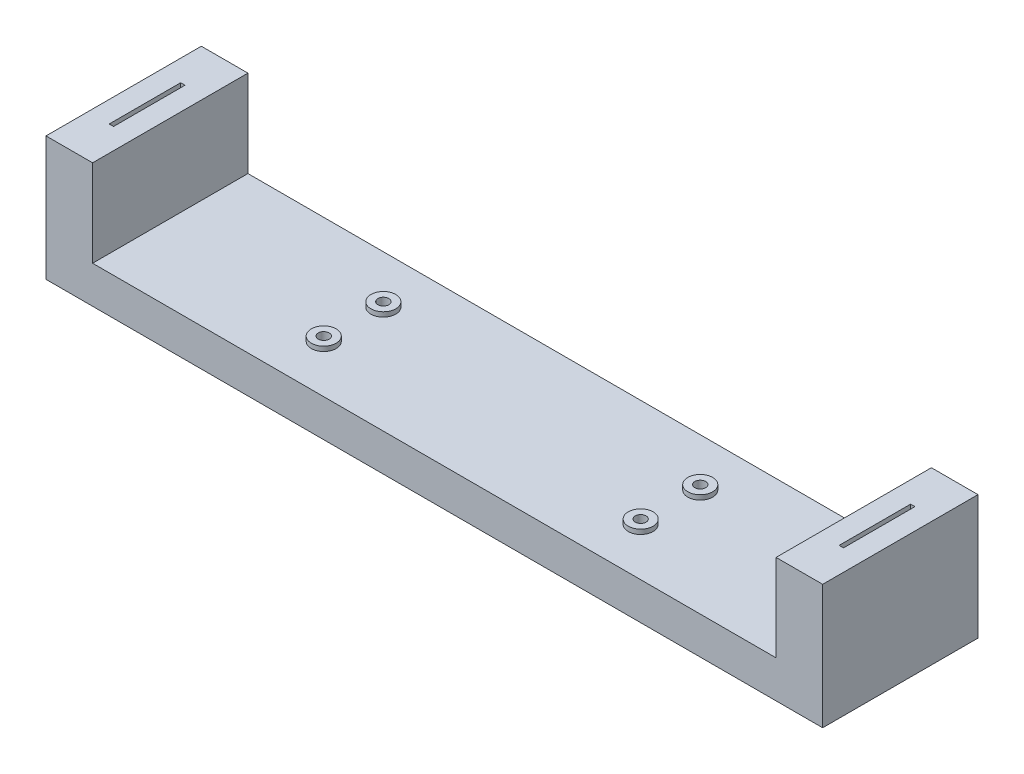
ISO-10303-21;
HEADER;
FILE_DESCRIPTION(('STEP AP214'),'2;1');
FILE_NAME('part.step','',(''),(''),'','','');
FILE_SCHEMA(('AUTOMOTIVE_DESIGN { 1 0 10303 214 1 1 1 1 }'));
ENDSEC;
DATA;
#1=APPLICATION_CONTEXT('core data for automotive mechanical design processes');
#2=APPLICATION_PROTOCOL_DEFINITION('international standard','automotive_design',2000,#1);
#3=PRODUCT_CONTEXT('',#1,'mechanical');
#4=PRODUCT('Part','Part','',(#3));
#5=PRODUCT_RELATED_PRODUCT_CATEGORY('part','',(#4));
#6=PRODUCT_DEFINITION_FORMATION('','',#4);
#7=PRODUCT_DEFINITION_CONTEXT('part definition',#1,'design');
#8=PRODUCT_DEFINITION('design','',#6,#7);
#9=PRODUCT_DEFINITION_SHAPE('','',#8);
#10=(LENGTH_UNIT() NAMED_UNIT(*) SI_UNIT(.MILLI.,.METRE.));
#11=(NAMED_UNIT(*) PLANE_ANGLE_UNIT() SI_UNIT($,.RADIAN.));
#12=(NAMED_UNIT(*) SI_UNIT($,.STERADIAN.) SOLID_ANGLE_UNIT());
#13=UNCERTAINTY_MEASURE_WITH_UNIT(LENGTH_MEASURE(1.E-05),#10,'distance_accuracy_value','');
#14=(GEOMETRIC_REPRESENTATION_CONTEXT(3) GLOBAL_UNCERTAINTY_ASSIGNED_CONTEXT((#13)) GLOBAL_UNIT_ASSIGNED_CONTEXT((#10,
#11,#12)) REPRESENTATION_CONTEXT('',''));
#15=CARTESIAN_POINT('',(0.,0.,0.));
#16=DIRECTION('',(0.,0.,1.));
#17=DIRECTION('',(1.,0.,0.));
#18=AXIS2_PLACEMENT_3D('',#15,#16,#17);
#19=CARTESIAN_POINT('',(0.,12.,0.));
#20=DIRECTION('',(0.,1.,0.));
#21=DIRECTION('',(0.,0.,1.));
#22=AXIS2_PLACEMENT_3D('',#19,#20,#21);
#23=PLANE('',#22);
#24=CARTESIAN_POINT('',(51.0067824662994,12.,-9.59041140266847));
#25=DIRECTION('',(0.,1.,0.));
#26=DIRECTION('',(0.,0.,1.));
#27=AXIS2_PLACEMENT_3D('',#24,#25,#26);
#28=CIRCLE('',#27,4.);
#29=CARTESIAN_POINT('',(51.0067824662994,12.,-5.59041140266847));
#30=VERTEX_POINT('',#29);
#31=EDGE_CURVE('E407',#30,#30,#28,.T.);
#32=ORIENTED_EDGE('',*,*,#31,.F.);
#33=EDGE_LOOP('',(#32));
#34=FACE_BOUND('',#33,.T.);
#35=CARTESIAN_POINT('',(-51.0067824663277,12.,9.59041140264349));
#36=DIRECTION('',(0.,1.,0.));
#37=DIRECTION('',(0.,0.,1.));
#38=AXIS2_PLACEMENT_3D('',#35,#36,#37);
#39=CIRCLE('',#38,4.00000000000001);
#40=CARTESIAN_POINT('',(-51.0067824663277,12.,13.5904114026435));
#41=VERTEX_POINT('',#40);
#42=EDGE_CURVE('E375',#41,#41,#39,.T.);
#43=ORIENTED_EDGE('',*,*,#42,.F.);
#44=EDGE_LOOP('',(#43));
#45=FACE_BOUND('',#44,.T.);
#46=DIRECTION('',(0.,0.,1.));
#47=VECTOR('',#46,1.);
#48=CARTESIAN_POINT('',(110.,12.,0.));
#49=LINE('',#48,#47);
#50=CARTESIAN_POINT('',(110.,12.,-25.));
#51=VERTEX_POINT('',#50);
#52=CARTESIAN_POINT('',(110.,12.,25.));
#53=VERTEX_POINT('',#52);
#54=EDGE_CURVE('E253',#51,#53,#49,.T.);
#55=ORIENTED_EDGE('',*,*,#54,.F.);
#56=DIRECTION('',(-1.,0.,0.));
#57=VECTOR('',#56,1.);
#58=CARTESIAN_POINT('',(0.,12.,-25.));
#59=LINE('',#58,#57);
#60=CARTESIAN_POINT('',(-110.,12.,-25.));
#61=VERTEX_POINT('',#60);
#62=EDGE_CURVE('E256',#51,#61,#59,.T.);
#63=ORIENTED_EDGE('',*,*,#62,.T.);
#64=DIRECTION('',(0.,0.,1.));
#65=VECTOR('',#64,1.);
#66=CARTESIAN_POINT('',(-110.,12.,0.));
#67=LINE('',#66,#65);
#68=CARTESIAN_POINT('',(-110.,12.,25.));
#69=VERTEX_POINT('',#68);
#70=EDGE_CURVE('E260',#61,#69,#67,.T.);
#71=ORIENTED_EDGE('',*,*,#70,.T.);
#72=DIRECTION('',(-1.,0.,0.));
#73=VECTOR('',#72,1.);
#74=CARTESIAN_POINT('',(0.,12.,25.));
#75=LINE('',#74,#73);
#76=EDGE_CURVE('E263',#53,#69,#75,.T.);
#77=ORIENTED_EDGE('',*,*,#76,.F.);
#78=EDGE_LOOP('',(#55,#63,#71,#77));
#79=FACE_BOUND('',#78,.T.);
#80=CARTESIAN_POINT('',(51.0067824662992,12.,9.59041140264416));
#81=DIRECTION('',(0.,1.,0.));
#82=DIRECTION('',(0.,0.,1.));
#83=AXIS2_PLACEMENT_3D('',#80,#81,#82);
#84=CIRCLE('',#83,4.00000000000001);
#85=CARTESIAN_POINT('',(51.0067824662992,12.,13.5904114026442));
#86=VERTEX_POINT('',#85);
#87=EDGE_CURVE('E415',#86,#86,#84,.T.);
#88=ORIENTED_EDGE('',*,*,#87,.F.);
#89=EDGE_LOOP('',(#88));
#90=FACE_BOUND('',#89,.T.);
#91=CARTESIAN_POINT('',(-51.0067824663275,12.,-9.59041140265167));
#92=DIRECTION('',(0.,1.,0.));
#93=DIRECTION('',(0.,0.,1.));
#94=AXIS2_PLACEMENT_3D('',#91,#92,#93);
#95=CIRCLE('',#94,4.00000000000001);
#96=CARTESIAN_POINT('',(-51.0067824663275,12.,-5.59041140265166));
#97=VERTEX_POINT('',#96);
#98=EDGE_CURVE('E381',#97,#97,#95,.T.);
#99=ORIENTED_EDGE('',*,*,#98,.F.);
#100=EDGE_LOOP('',(#99));
#101=FACE_BOUND('',#100,.T.);
#102=ADVANCED_FACE('F43',(#34,#45,#79,#90,#101),#23,.T.);
#103=CARTESIAN_POINT('',(-110.,40.,0.));
#104=DIRECTION('',(1.,0.,0.));
#105=DIRECTION('',(0.,0.,-1.));
#106=AXIS2_PLACEMENT_3D('',#103,#104,#105);
#107=PLANE('',#106);
#108=ORIENTED_EDGE('',*,*,#70,.F.);
#109=DIRECTION('',(0.,-1.,0.));
#110=VECTOR('',#109,1.);
#111=CARTESIAN_POINT('',(-110.,40.,-25.));
#112=LINE('',#111,#110);
#113=CARTESIAN_POINT('',(-110.,40.,-25.));
#114=VERTEX_POINT('',#113);
#115=EDGE_CURVE('E11',#114,#61,#112,.T.);
#116=ORIENTED_EDGE('',*,*,#115,.F.);
#117=DIRECTION('',(0.,0.,1.));
#118=VECTOR('',#117,1.);
#119=CARTESIAN_POINT('',(-110.,40.,0.));
#120=LINE('',#119,#118);
#121=CARTESIAN_POINT('',(-110.,40.,25.));
#122=VERTEX_POINT('',#121);
#123=EDGE_CURVE('E274',#114,#122,#120,.T.);
#124=ORIENTED_EDGE('',*,*,#123,.T.);
#125=DIRECTION('',(0.,-1.,0.));
#126=VECTOR('',#125,1.);
#127=CARTESIAN_POINT('',(-110.,40.,25.));
#128=LINE('',#127,#126);
#129=EDGE_CURVE('E287',#122,#69,#128,.T.);
#130=ORIENTED_EDGE('',*,*,#129,.T.);
#131=EDGE_LOOP('',(#108,#116,#124,#130));
#132=FACE_BOUND('',#131,.T.);
#133=ADVANCED_FACE('F45',(#132),#107,.T.);
#134=CARTESIAN_POINT('',(0.,40.,-25.));
#135=DIRECTION('',(0.,0.,-1.));
#136=DIRECTION('',(-1.,0.,0.));
#137=AXIS2_PLACEMENT_3D('',#134,#135,#136);
#138=PLANE('',#137);
#139=DIRECTION('',(1.,0.,0.));
#140=VECTOR('',#139,1.);
#141=CARTESIAN_POINT('',(0.,0.,-25.));
#142=LINE('',#141,#140);
#143=CARTESIAN_POINT('',(-125.,0.,-25.));
#144=VERTEX_POINT('',#143);
#145=CARTESIAN_POINT('',(125.,0.,-25.));
#146=VERTEX_POINT('',#145);
#147=EDGE_CURVE('E266',#144,#146,#142,.T.);
#148=ORIENTED_EDGE('',*,*,#147,.F.);
#149=DIRECTION('',(0.,-1.,0.));
#150=VECTOR('',#149,1.);
#151=CARTESIAN_POINT('',(-125.,40.,-25.));
#152=LINE('',#151,#150);
#153=CARTESIAN_POINT('',(-125.,40.,-25.));
#154=VERTEX_POINT('',#153);
#155=EDGE_CURVE('E51',#154,#144,#152,.T.);
#156=ORIENTED_EDGE('',*,*,#155,.F.);
#157=DIRECTION('',(1.,0.,0.));
#158=VECTOR('',#157,1.);
#159=CARTESIAN_POINT('',(0.,40.,-25.));
#160=LINE('',#159,#158);
#161=EDGE_CURVE('E277',#154,#114,#160,.T.);
#162=ORIENTED_EDGE('',*,*,#161,.T.);
#163=ORIENTED_EDGE('',*,*,#115,.T.);
#164=ORIENTED_EDGE('',*,*,#62,.F.);
#165=DIRECTION('',(0.,-1.,0.));
#166=VECTOR('',#165,1.);
#167=CARTESIAN_POINT('',(110.,40.,-25.));
#168=LINE('',#167,#166);
#169=CARTESIAN_POINT('',(110.,40.,-25.));
#170=VERTEX_POINT('',#169);
#171=EDGE_CURVE('E238',#170,#51,#168,.T.);
#172=ORIENTED_EDGE('',*,*,#171,.F.);
#173=DIRECTION('',(-1.,0.,0.));
#174=VECTOR('',#173,1.);
#175=CARTESIAN_POINT('',(0.,40.,-25.));
#176=LINE('',#175,#174);
#177=CARTESIAN_POINT('',(125.,40.,-25.));
#178=VERTEX_POINT('',#177);
#179=EDGE_CURVE('E236',#178,#170,#176,.T.);
#180=ORIENTED_EDGE('',*,*,#179,.F.);
#181=DIRECTION('',(0.,-1.,0.));
#182=VECTOR('',#181,1.);
#183=CARTESIAN_POINT('',(125.,40.,-25.));
#184=LINE('',#183,#182);
#185=EDGE_CURVE('E243',#178,#146,#184,.T.);
#186=ORIENTED_EDGE('',*,*,#185,.T.);
#187=EDGE_LOOP('',(#148,#156,#162,#163,#164,#172,#180,#186));
#188=FACE_BOUND('',#187,.T.);
#189=ADVANCED_FACE('F303',(#188),#138,.T.);
#190=CARTESIAN_POINT('',(-125.,40.,0.));
#191=DIRECTION('',(-1.,0.,0.));
#192=DIRECTION('',(0.,0.,1.));
#193=AXIS2_PLACEMENT_3D('',#190,#191,#192);
#194=PLANE('',#193);
#195=DIRECTION('',(0.,0.,-1.));
#196=VECTOR('',#195,1.);
#197=CARTESIAN_POINT('',(-125.,0.,0.));
#198=LINE('',#197,#196);
#199=CARTESIAN_POINT('',(-125.,0.,25.));
#200=VERTEX_POINT('',#199);
#201=EDGE_CURVE('E289',#200,#144,#198,.T.);
#202=ORIENTED_EDGE('',*,*,#201,.F.);
#203=DIRECTION('',(0.,-1.,0.));
#204=VECTOR('',#203,1.);
#205=CARTESIAN_POINT('',(-125.,40.,25.));
#206=LINE('',#205,#204);
#207=CARTESIAN_POINT('',(-125.,40.,25.));
#208=VERTEX_POINT('',#207);
#209=EDGE_CURVE('E295',#208,#200,#206,.T.);
#210=ORIENTED_EDGE('',*,*,#209,.F.);
#211=DIRECTION('',(0.,0.,-1.));
#212=VECTOR('',#211,1.);
#213=CARTESIAN_POINT('',(-125.,40.,0.));
#214=LINE('',#213,#212);
#215=EDGE_CURVE('E281',#208,#154,#214,.T.);
#216=ORIENTED_EDGE('',*,*,#215,.T.);
#217=ORIENTED_EDGE('',*,*,#155,.T.);
#218=EDGE_LOOP('',(#202,#210,#216,#217));
#219=FACE_BOUND('',#218,.T.);
#220=ADVANCED_FACE('F299',(#219),#194,.T.);
#221=CARTESIAN_POINT('',(0.,40.,25.));
#222=DIRECTION('',(0.,0.,1.));
#223=DIRECTION('',(1.,0.,0.));
#224=AXIS2_PLACEMENT_3D('',#221,#222,#223);
#225=PLANE('',#224);
#226=DIRECTION('',(-1.,0.,0.));
#227=VECTOR('',#226,1.);
#228=CARTESIAN_POINT('',(0.,0.,25.));
#229=LINE('',#228,#227);
#230=CARTESIAN_POINT('',(125.,0.,25.));
#231=VERTEX_POINT('',#230);
#232=EDGE_CURVE('E278',#231,#200,#229,.T.);
#233=ORIENTED_EDGE('',*,*,#232,.F.);
#234=DIRECTION('',(0.,-1.,0.));
#235=VECTOR('',#234,1.);
#236=CARTESIAN_POINT('',(125.,40.,25.));
#237=LINE('',#236,#235);
#238=CARTESIAN_POINT('',(125.,40.,25.));
#239=VERTEX_POINT('',#238);
#240=EDGE_CURVE('E246',#239,#231,#237,.T.);
#241=ORIENTED_EDGE('',*,*,#240,.F.);
#242=DIRECTION('',(-1.,0.,0.));
#243=VECTOR('',#242,1.);
#244=CARTESIAN_POINT('',(0.,40.,25.));
#245=LINE('',#244,#243);
#246=CARTESIAN_POINT('',(110.,40.,25.));
#247=VERTEX_POINT('',#246);
#248=EDGE_CURVE('E231',#239,#247,#245,.T.);
#249=ORIENTED_EDGE('',*,*,#248,.T.);
#250=DIRECTION('',(0.,-1.,0.));
#251=VECTOR('',#250,1.);
#252=CARTESIAN_POINT('',(110.,40.,25.));
#253=LINE('',#252,#251);
#254=EDGE_CURVE('E249',#247,#53,#253,.T.);
#255=ORIENTED_EDGE('',*,*,#254,.T.);
#256=ORIENTED_EDGE('',*,*,#76,.T.);
#257=ORIENTED_EDGE('',*,*,#129,.F.);
#258=DIRECTION('',(-1.,0.,0.));
#259=VECTOR('',#258,1.);
#260=CARTESIAN_POINT('',(0.,40.,25.));
#261=LINE('',#260,#259);
#262=EDGE_CURVE('E284',#122,#208,#261,.T.);
#263=ORIENTED_EDGE('',*,*,#262,.T.);
#264=ORIENTED_EDGE('',*,*,#209,.T.);
#265=EDGE_LOOP('',(#233,#241,#249,#255,#256,#257,#263,#264));
#266=FACE_BOUND('',#265,.T.);
#267=ADVANCED_FACE('F311',(#266),#225,.T.);
#268=CARTESIAN_POINT('',(0.,40.,0.));
#269=DIRECTION('',(0.,1.,0.));
#270=DIRECTION('',(0.,0.,1.));
#271=AXIS2_PLACEMENT_3D('',#268,#269,#270);
#272=PLANE('',#271);
#273=DIRECTION('',(0.,0.,1.));
#274=VECTOR('',#273,1.);
#275=CARTESIAN_POINT('',(-118.15,40.,11.5));
#276=LINE('',#275,#274);
#277=CARTESIAN_POINT('',(-118.15,40.,-11.5));
#278=VERTEX_POINT('',#277);
#279=CARTESIAN_POINT('',(-118.15,40.,11.5));
#280=VERTEX_POINT('',#279);
#281=EDGE_CURVE('E66',#278,#280,#276,.T.);
#282=ORIENTED_EDGE('',*,*,#281,.F.);
#283=DIRECTION('',(-1.,0.,0.));
#284=VECTOR('',#283,1.);
#285=CARTESIAN_POINT('',(-116.75,40.,-11.5));
#286=LINE('',#285,#284);
#287=CARTESIAN_POINT('',(-116.75,40.,-11.5));
#288=VERTEX_POINT('',#287);
#289=EDGE_CURVE('E201',#288,#278,#286,.T.);
#290=ORIENTED_EDGE('',*,*,#289,.F.);
#291=DIRECTION('',(0.,0.,-1.));
#292=VECTOR('',#291,1.);
#293=CARTESIAN_POINT('',(-116.75,40.,11.5));
#294=LINE('',#293,#292);
#295=CARTESIAN_POINT('',(-116.75,40.,11.5));
#296=VERTEX_POINT('',#295);
#297=EDGE_CURVE('E215',#296,#288,#294,.T.);
#298=ORIENTED_EDGE('',*,*,#297,.F.);
#299=DIRECTION('',(1.,0.,0.));
#300=VECTOR('',#299,1.);
#301=CARTESIAN_POINT('',(-116.75,40.,11.5));
#302=LINE('',#301,#300);
#303=EDGE_CURVE('E212',#280,#296,#302,.T.);
#304=ORIENTED_EDGE('',*,*,#303,.F.);
#305=EDGE_LOOP('',(#282,#290,#298,#304));
#306=FACE_BOUND('',#305,.T.);
#307=ORIENTED_EDGE('',*,*,#123,.F.);
#308=ORIENTED_EDGE('',*,*,#161,.F.);
#309=ORIENTED_EDGE('',*,*,#215,.F.);
#310=ORIENTED_EDGE('',*,*,#262,.F.);
#311=EDGE_LOOP('',(#307,#308,#309,#310));
#312=FACE_BOUND('',#311,.T.);
#313=ADVANCED_FACE('F328',(#306,#312),#272,.T.);
#314=CARTESIAN_POINT('',(0.,0.,0.));
#315=DIRECTION('',(0.,1.,0.));
#316=DIRECTION('',(0.,0.,1.));
#317=AXIS2_PLACEMENT_3D('',#314,#315,#316);
#318=PLANE('',#317);
#319=CARTESIAN_POINT('',(-51.0067824663275,0.,-9.59041140265167));
#320=DIRECTION('',(0.,1.,0.));
#321=DIRECTION('',(0.,0.,1.));
#322=AXIS2_PLACEMENT_3D('',#319,#320,#321);
#323=CIRCLE('',#322,1.75000000000002);
#324=CARTESIAN_POINT('',(-51.0067824663275,0.,-7.84041140265165));
#325=VERTEX_POINT('',#324);
#326=EDGE_CURVE('E182',#325,#325,#323,.T.);
#327=ORIENTED_EDGE('',*,*,#326,.T.);
#328=EDGE_LOOP('',(#327));
#329=FACE_BOUND('',#328,.T.);
#330=ORIENTED_EDGE('',*,*,#147,.T.);
#331=DIRECTION('',(0.,0.,-1.));
#332=VECTOR('',#331,1.);
#333=CARTESIAN_POINT('',(125.,0.,0.));
#334=LINE('',#333,#332);
#335=EDGE_CURVE('E222',#231,#146,#334,.T.);
#336=ORIENTED_EDGE('',*,*,#335,.F.);
#337=ORIENTED_EDGE('',*,*,#232,.T.);
#338=ORIENTED_EDGE('',*,*,#201,.T.);
#339=EDGE_LOOP('',(#330,#336,#337,#338));
#340=FACE_BOUND('',#339,.T.);
#341=CARTESIAN_POINT('',(-51.0067824663277,0.,9.59041140264349));
#342=DIRECTION('',(0.,1.,0.));
#343=DIRECTION('',(0.,0.,1.));
#344=AXIS2_PLACEMENT_3D('',#341,#342,#343);
#345=CIRCLE('',#344,1.74999999999498);
#346=CARTESIAN_POINT('',(-51.0067824663277,0.,11.3404114026385));
#347=VERTEX_POINT('',#346);
#348=EDGE_CURVE('E252',#347,#347,#345,.T.);
#349=ORIENTED_EDGE('',*,*,#348,.T.);
#350=EDGE_LOOP('',(#349));
#351=FACE_BOUND('',#350,.T.);
#352=CARTESIAN_POINT('',(51.0067824662992,0.,9.59041140264416));
#353=DIRECTION('',(0.,1.,0.));
#354=DIRECTION('',(0.,0.,1.));
#355=AXIS2_PLACEMENT_3D('',#352,#353,#354);
#356=CIRCLE('',#355,1.74999999999502);
#357=CARTESIAN_POINT('',(51.0067824662992,0.,11.3404114026392));
#358=VERTEX_POINT('',#357);
#359=EDGE_CURVE('E269',#358,#358,#356,.T.);
#360=ORIENTED_EDGE('',*,*,#359,.T.);
#361=EDGE_LOOP('',(#360));
#362=FACE_BOUND('',#361,.T.);
#363=CARTESIAN_POINT('',(51.0067824662994,0.,-9.59041140266847));
#364=DIRECTION('',(0.,1.,0.));
#365=DIRECTION('',(0.,0.,1.));
#366=AXIS2_PLACEMENT_3D('',#363,#364,#365);
#367=CIRCLE('',#366,1.74999999999499);
#368=CARTESIAN_POINT('',(51.0067824662994,0.,-7.84041140267348));
#369=VERTEX_POINT('',#368);
#370=EDGE_CURVE('E257',#369,#369,#367,.T.);
#371=ORIENTED_EDGE('',*,*,#370,.T.);
#372=EDGE_LOOP('',(#371));
#373=FACE_BOUND('',#372,.T.);
#374=ADVANCED_FACE('F308',(#329,#340,#351,#362,#373),#318,.F.);
#375=CARTESIAN_POINT('',(51.0067824662994,12.,-9.59041140266847));
#376=DIRECTION('',(0.,-1.,0.));
#377=DIRECTION('',(0.,0.,-1.));
#378=AXIS2_PLACEMENT_3D('',#375,#376,#377);
#379=CYLINDRICAL_SURFACE('',#378,1.74999999999499);
#380=ORIENTED_EDGE('',*,*,#370,.F.);
#381=EDGE_LOOP('',(#380));
#382=FACE_BOUND('',#381,.T.);
#383=CARTESIAN_POINT('',(51.0067824662994,13.5,-9.59041140266847));
#384=DIRECTION('',(0.,1.,0.));
#385=DIRECTION('',(0.,0.,1.));
#386=AXIS2_PLACEMENT_3D('',#383,#384,#385);
#387=CIRCLE('',#386,1.74999999999499);
#388=CARTESIAN_POINT('',(51.0067824662994,13.5,-7.84041140267347));
#389=VERTEX_POINT('',#388);
#390=EDGE_CURVE('E402',#389,#389,#387,.T.);
#391=ORIENTED_EDGE('',*,*,#390,.T.);
#392=EDGE_LOOP('',(#391));
#393=FACE_BOUND('',#392,.T.);
#394=ADVANCED_FACE('F338',(#382,#393),#379,.F.);
#395=CARTESIAN_POINT('',(51.0067824662992,12.,9.59041140264416));
#396=DIRECTION('',(0.,-1.,0.));
#397=DIRECTION('',(0.,0.,-1.));
#398=AXIS2_PLACEMENT_3D('',#395,#396,#397);
#399=CYLINDRICAL_SURFACE('',#398,1.74999999999502);
#400=ORIENTED_EDGE('',*,*,#359,.F.);
#401=EDGE_LOOP('',(#400));
#402=FACE_BOUND('',#401,.T.);
#403=CARTESIAN_POINT('',(51.0067824662992,13.5,9.59041140264416));
#404=DIRECTION('',(0.,1.,0.));
#405=DIRECTION('',(0.,0.,1.));
#406=AXIS2_PLACEMENT_3D('',#403,#404,#405);
#407=CIRCLE('',#406,1.74999999999502);
#408=CARTESIAN_POINT('',(51.0067824662992,13.5,11.3404114026392));
#409=VERTEX_POINT('',#408);
#410=EDGE_CURVE('E385',#409,#409,#407,.T.);
#411=ORIENTED_EDGE('',*,*,#410,.T.);
#412=EDGE_LOOP('',(#411));
#413=FACE_BOUND('',#412,.T.);
#414=ADVANCED_FACE('F358',(#402,#413),#399,.F.);
#415=CARTESIAN_POINT('',(-51.0067824663277,12.,9.59041140264349));
#416=DIRECTION('',(0.,-1.,0.));
#417=DIRECTION('',(0.,0.,-1.));
#418=AXIS2_PLACEMENT_3D('',#415,#416,#417);
#419=CYLINDRICAL_SURFACE('',#418,1.74999999999498);
#420=ORIENTED_EDGE('',*,*,#348,.F.);
#421=EDGE_LOOP('',(#420));
#422=FACE_BOUND('',#421,.T.);
#423=CARTESIAN_POINT('',(-51.0067824663277,13.5,9.59041140264349));
#424=DIRECTION('',(0.,1.,0.));
#425=DIRECTION('',(0.,0.,1.));
#426=AXIS2_PLACEMENT_3D('',#423,#424,#425);
#427=CIRCLE('',#426,1.74999999999498);
#428=CARTESIAN_POINT('',(-51.0067824663277,13.5,11.3404114026385));
#429=VERTEX_POINT('',#428);
#430=EDGE_CURVE('E373',#429,#429,#427,.T.);
#431=ORIENTED_EDGE('',*,*,#430,.T.);
#432=EDGE_LOOP('',(#431));
#433=FACE_BOUND('',#432,.T.);
#434=ADVANCED_FACE('F361',(#422,#433),#419,.F.);
#435=CARTESIAN_POINT('',(110.,40.,0.));
#436=DIRECTION('',(-1.,0.,0.));
#437=DIRECTION('',(0.,0.,1.));
#438=AXIS2_PLACEMENT_3D('',#435,#436,#437);
#439=PLANE('',#438);
#440=ORIENTED_EDGE('',*,*,#171,.T.);
#441=ORIENTED_EDGE('',*,*,#54,.T.);
#442=ORIENTED_EDGE('',*,*,#254,.F.);
#443=DIRECTION('',(0.,0.,-1.));
#444=VECTOR('',#443,1.);
#445=CARTESIAN_POINT('',(110.,40.,0.));
#446=LINE('',#445,#444);
#447=EDGE_CURVE('E228',#247,#170,#446,.T.);
#448=ORIENTED_EDGE('',*,*,#447,.T.);
#449=EDGE_LOOP('',(#440,#441,#442,#448));
#450=FACE_BOUND('',#449,.T.);
#451=ADVANCED_FACE('F320',(#450),#439,.T.);
#452=CARTESIAN_POINT('',(125.,40.,0.));
#453=DIRECTION('',(-1.,0.,0.));
#454=DIRECTION('',(0.,0.,1.));
#455=AXIS2_PLACEMENT_3D('',#452,#453,#454);
#456=PLANE('',#455);
#457=ORIENTED_EDGE('',*,*,#335,.T.);
#458=ORIENTED_EDGE('',*,*,#185,.F.);
#459=DIRECTION('',(0.,0.,-1.));
#460=VECTOR('',#459,1.);
#461=CARTESIAN_POINT('',(125.,40.,0.));
#462=LINE('',#461,#460);
#463=EDGE_CURVE('E234',#239,#178,#462,.T.);
#464=ORIENTED_EDGE('',*,*,#463,.F.);
#465=ORIENTED_EDGE('',*,*,#240,.T.);
#466=EDGE_LOOP('',(#457,#458,#464,#465));
#467=FACE_BOUND('',#466,.T.);
#468=ADVANCED_FACE('F314',(#467),#456,.F.);
#469=CARTESIAN_POINT('',(0.,40.,0.));
#470=DIRECTION('',(0.,1.,0.));
#471=DIRECTION('',(0.,0.,1.));
#472=AXIS2_PLACEMENT_3D('',#469,#470,#471);
#473=PLANE('',#472);
#474=DIRECTION('',(0.,0.,-1.));
#475=VECTOR('',#474,1.);
#476=CARTESIAN_POINT('',(118.2,40.,11.5));
#477=LINE('',#476,#475);
#478=CARTESIAN_POINT('',(118.2,40.,11.5));
#479=VERTEX_POINT('',#478);
#480=CARTESIAN_POINT('',(118.2,40.,-11.5));
#481=VERTEX_POINT('',#480);
#482=EDGE_CURVE('E58',#479,#481,#477,.T.);
#483=ORIENTED_EDGE('',*,*,#482,.F.);
#484=DIRECTION('',(1.,0.,0.));
#485=VECTOR('',#484,1.);
#486=CARTESIAN_POINT('',(116.8,40.,11.5));
#487=LINE('',#486,#485);
#488=CARTESIAN_POINT('',(116.8,40.,11.5));
#489=VERTEX_POINT('',#488);
#490=EDGE_CURVE('E176',#489,#479,#487,.T.);
#491=ORIENTED_EDGE('',*,*,#490,.F.);
#492=DIRECTION('',(0.,0.,1.));
#493=VECTOR('',#492,1.);
#494=CARTESIAN_POINT('',(116.8,40.,11.5));
#495=LINE('',#494,#493);
#496=CARTESIAN_POINT('',(116.8,40.,-11.5));
#497=VERTEX_POINT('',#496);
#498=EDGE_CURVE('E179',#497,#489,#495,.T.);
#499=ORIENTED_EDGE('',*,*,#498,.F.);
#500=DIRECTION('',(-1.,0.,0.));
#501=VECTOR('',#500,1.);
#502=CARTESIAN_POINT('',(116.8,40.,-11.5));
#503=LINE('',#502,#501);
#504=EDGE_CURVE('E188',#481,#497,#503,.T.);
#505=ORIENTED_EDGE('',*,*,#504,.F.);
#506=EDGE_LOOP('',(#483,#491,#499,#505));
#507=FACE_BOUND('',#506,.T.);
#508=ORIENTED_EDGE('',*,*,#447,.F.);
#509=ORIENTED_EDGE('',*,*,#248,.F.);
#510=ORIENTED_EDGE('',*,*,#463,.T.);
#511=ORIENTED_EDGE('',*,*,#179,.T.);
#512=EDGE_LOOP('',(#508,#509,#510,#511));
#513=FACE_BOUND('',#512,.T.);
#514=ADVANCED_FACE('F318',(#507,#513),#473,.T.);
#515=CARTESIAN_POINT('',(-118.15,10.,11.5));
#516=DIRECTION('',(-1.,0.,0.));
#517=DIRECTION('',(0.,0.,1.));
#518=AXIS2_PLACEMENT_3D('',#515,#516,#517);
#519=PLANE('',#518);
#520=ORIENTED_EDGE('',*,*,#281,.T.);
#521=DIRECTION('',(0.,1.,0.));
#522=VECTOR('',#521,1.);
#523=CARTESIAN_POINT('',(-118.15,10.,11.5));
#524=LINE('',#523,#522);
#525=CARTESIAN_POINT('',(-118.15,10.,11.5));
#526=VERTEX_POINT('',#525);
#527=EDGE_CURVE('E210',#526,#280,#524,.T.);
#528=ORIENTED_EDGE('',*,*,#527,.F.);
#529=DIRECTION('',(0.,0.,1.));
#530=VECTOR('',#529,1.);
#531=CARTESIAN_POINT('',(-118.15,10.,11.5));
#532=LINE('',#531,#530);
#533=CARTESIAN_POINT('',(-118.15,10.,-11.5));
#534=VERTEX_POINT('',#533);
#535=EDGE_CURVE('E197',#534,#526,#532,.T.);
#536=ORIENTED_EDGE('',*,*,#535,.F.);
#537=DIRECTION('',(0.,1.,0.));
#538=VECTOR('',#537,1.);
#539=CARTESIAN_POINT('',(-118.15,10.,-11.5));
#540=LINE('',#539,#538);
#541=EDGE_CURVE('E220',#534,#278,#540,.T.);
#542=ORIENTED_EDGE('',*,*,#541,.T.);
#543=EDGE_LOOP('',(#520,#528,#536,#542));
#544=FACE_BOUND('',#543,.T.);
#545=ADVANCED_FACE('F481',(#544),#519,.F.);
#546=CARTESIAN_POINT('',(-116.75,10.,-11.5));
#547=DIRECTION('',(0.,0.,-1.));
#548=DIRECTION('',(-1.,0.,0.));
#549=AXIS2_PLACEMENT_3D('',#546,#547,#548);
#550=PLANE('',#549);
#551=ORIENTED_EDGE('',*,*,#289,.T.);
#552=ORIENTED_EDGE('',*,*,#541,.F.);
#553=DIRECTION('',(-1.,0.,0.));
#554=VECTOR('',#553,1.);
#555=CARTESIAN_POINT('',(-116.75,10.,-11.5));
#556=LINE('',#555,#554);
#557=CARTESIAN_POINT('',(-116.75,10.,-11.5));
#558=VERTEX_POINT('',#557);
#559=EDGE_CURVE('E207',#558,#534,#556,.T.);
#560=ORIENTED_EDGE('',*,*,#559,.F.);
#561=DIRECTION('',(0.,1.,0.));
#562=VECTOR('',#561,1.);
#563=CARTESIAN_POINT('',(-116.75,10.,-11.5));
#564=LINE('',#563,#562);
#565=EDGE_CURVE('E223',#558,#288,#564,.T.);
#566=ORIENTED_EDGE('',*,*,#565,.T.);
#567=EDGE_LOOP('',(#551,#552,#560,#566));
#568=FACE_BOUND('',#567,.T.);
#569=ADVANCED_FACE('F477',(#568),#550,.F.);
#570=CARTESIAN_POINT('',(-116.75,10.,11.5));
#571=DIRECTION('',(1.,0.,0.));
#572=DIRECTION('',(0.,0.,-1.));
#573=AXIS2_PLACEMENT_3D('',#570,#571,#572);
#574=PLANE('',#573);
#575=ORIENTED_EDGE('',*,*,#297,.T.);
#576=ORIENTED_EDGE('',*,*,#565,.F.);
#577=DIRECTION('',(0.,0.,-1.));
#578=VECTOR('',#577,1.);
#579=CARTESIAN_POINT('',(-116.75,10.,11.5));
#580=LINE('',#579,#578);
#581=CARTESIAN_POINT('',(-116.75,10.,11.5));
#582=VERTEX_POINT('',#581);
#583=EDGE_CURVE('E204',#582,#558,#580,.T.);
#584=ORIENTED_EDGE('',*,*,#583,.F.);
#585=DIRECTION('',(0.,1.,0.));
#586=VECTOR('',#585,1.);
#587=CARTESIAN_POINT('',(-116.75,10.,11.5));
#588=LINE('',#587,#586);
#589=EDGE_CURVE('E225',#582,#296,#588,.T.);
#590=ORIENTED_EDGE('',*,*,#589,.T.);
#591=EDGE_LOOP('',(#575,#576,#584,#590));
#592=FACE_BOUND('',#591,.T.);
#593=ADVANCED_FACE('F480',(#592),#574,.F.);
#594=CARTESIAN_POINT('',(-116.75,10.,11.5));
#595=DIRECTION('',(0.,0.,1.));
#596=DIRECTION('',(1.,0.,0.));
#597=AXIS2_PLACEMENT_3D('',#594,#595,#596);
#598=PLANE('',#597);
#599=ORIENTED_EDGE('',*,*,#303,.T.);
#600=ORIENTED_EDGE('',*,*,#589,.F.);
#601=DIRECTION('',(1.,0.,0.));
#602=VECTOR('',#601,1.);
#603=CARTESIAN_POINT('',(-116.75,10.,11.5));
#604=LINE('',#603,#602);
#605=EDGE_CURVE('E200',#526,#582,#604,.T.);
#606=ORIENTED_EDGE('',*,*,#605,.F.);
#607=ORIENTED_EDGE('',*,*,#527,.T.);
#608=EDGE_LOOP('',(#599,#600,#606,#607));
#609=FACE_BOUND('',#608,.T.);
#610=ADVANCED_FACE('F475',(#609),#598,.F.);
#611=CARTESIAN_POINT('',(0.,10.,0.));
#612=DIRECTION('',(0.,1.,0.));
#613=DIRECTION('',(0.,0.,1.));
#614=AXIS2_PLACEMENT_3D('',#611,#612,#613);
#615=PLANE('',#614);
#616=ORIENTED_EDGE('',*,*,#535,.T.);
#617=ORIENTED_EDGE('',*,*,#605,.T.);
#618=ORIENTED_EDGE('',*,*,#583,.T.);
#619=ORIENTED_EDGE('',*,*,#559,.T.);
#620=EDGE_LOOP('',(#616,#617,#618,#619));
#621=FACE_BOUND('',#620,.T.);
#622=ADVANCED_FACE('F472',(#621),#615,.T.);
#623=CARTESIAN_POINT('',(118.2,10.,11.5));
#624=DIRECTION('',(1.,0.,0.));
#625=DIRECTION('',(0.,0.,-1.));
#626=AXIS2_PLACEMENT_3D('',#623,#624,#625);
#627=PLANE('',#626);
#628=ORIENTED_EDGE('',*,*,#482,.T.);
#629=DIRECTION('',(0.,1.,0.));
#630=VECTOR('',#629,1.);
#631=CARTESIAN_POINT('',(118.2,10.,-11.5));
#632=LINE('',#631,#630);
#633=CARTESIAN_POINT('',(118.2,10.,-11.5));
#634=VERTEX_POINT('',#633);
#635=EDGE_CURVE('E154',#634,#481,#632,.T.);
#636=ORIENTED_EDGE('',*,*,#635,.F.);
#637=DIRECTION('',(0.,0.,-1.));
#638=VECTOR('',#637,1.);
#639=CARTESIAN_POINT('',(118.2,10.,11.5));
#640=LINE('',#639,#638);
#641=CARTESIAN_POINT('',(118.2,10.,11.5));
#642=VERTEX_POINT('',#641);
#643=EDGE_CURVE('E158',#642,#634,#640,.T.);
#644=ORIENTED_EDGE('',*,*,#643,.F.);
#645=DIRECTION('',(0.,1.,0.));
#646=VECTOR('',#645,1.);
#647=CARTESIAN_POINT('',(118.2,10.,11.5));
#648=LINE('',#647,#646);
#649=EDGE_CURVE('E192',#642,#479,#648,.T.);
#650=ORIENTED_EDGE('',*,*,#649,.T.);
#651=EDGE_LOOP('',(#628,#636,#644,#650));
#652=FACE_BOUND('',#651,.T.);
#653=ADVANCED_FACE('F156',(#652),#627,.F.);
#654=CARTESIAN_POINT('',(116.8,10.,11.5));
#655=DIRECTION('',(0.,0.,1.));
#656=DIRECTION('',(1.,0.,0.));
#657=AXIS2_PLACEMENT_3D('',#654,#655,#656);
#658=PLANE('',#657);
#659=ORIENTED_EDGE('',*,*,#490,.T.);
#660=ORIENTED_EDGE('',*,*,#649,.F.);
#661=DIRECTION('',(1.,0.,0.));
#662=VECTOR('',#661,1.);
#663=CARTESIAN_POINT('',(116.8,10.,11.5));
#664=LINE('',#663,#662);
#665=CARTESIAN_POINT('',(116.8,10.,11.5));
#666=VERTEX_POINT('',#665);
#667=EDGE_CURVE('E164',#666,#642,#664,.T.);
#668=ORIENTED_EDGE('',*,*,#667,.F.);
#669=DIRECTION('',(0.,1.,0.));
#670=VECTOR('',#669,1.);
#671=CARTESIAN_POINT('',(116.8,10.,11.5));
#672=LINE('',#671,#670);
#673=EDGE_CURVE('E194',#666,#489,#672,.T.);
#674=ORIENTED_EDGE('',*,*,#673,.T.);
#675=EDGE_LOOP('',(#659,#660,#668,#674));
#676=FACE_BOUND('',#675,.T.);
#677=ADVANCED_FACE('F460',(#676),#658,.F.);
#678=CARTESIAN_POINT('',(116.8,10.,11.5));
#679=DIRECTION('',(-1.,0.,0.));
#680=DIRECTION('',(0.,0.,1.));
#681=AXIS2_PLACEMENT_3D('',#678,#679,#680);
#682=PLANE('',#681);
#683=ORIENTED_EDGE('',*,*,#498,.T.);
#684=ORIENTED_EDGE('',*,*,#673,.F.);
#685=DIRECTION('',(0.,0.,1.));
#686=VECTOR('',#685,1.);
#687=CARTESIAN_POINT('',(116.8,10.,11.5));
#688=LINE('',#687,#686);
#689=CARTESIAN_POINT('',(116.8,10.,-11.5));
#690=VERTEX_POINT('',#689);
#691=EDGE_CURVE('E172',#690,#666,#688,.T.);
#692=ORIENTED_EDGE('',*,*,#691,.F.);
#693=DIRECTION('',(0.,1.,0.));
#694=VECTOR('',#693,1.);
#695=CARTESIAN_POINT('',(116.8,10.,-11.5));
#696=LINE('',#695,#694);
#697=EDGE_CURVE('E163',#690,#497,#696,.T.);
#698=ORIENTED_EDGE('',*,*,#697,.T.);
#699=EDGE_LOOP('',(#683,#684,#692,#698));
#700=FACE_BOUND('',#699,.T.);
#701=ADVANCED_FACE('F463',(#700),#682,.F.);
#702=CARTESIAN_POINT('',(116.8,10.,-11.5));
#703=DIRECTION('',(0.,0.,-1.));
#704=DIRECTION('',(-1.,0.,0.));
#705=AXIS2_PLACEMENT_3D('',#702,#703,#704);
#706=PLANE('',#705);
#707=ORIENTED_EDGE('',*,*,#504,.T.);
#708=ORIENTED_EDGE('',*,*,#697,.F.);
#709=DIRECTION('',(-1.,0.,0.));
#710=VECTOR('',#709,1.);
#711=CARTESIAN_POINT('',(116.8,10.,-11.5));
#712=LINE('',#711,#710);
#713=EDGE_CURVE('E167',#634,#690,#712,.T.);
#714=ORIENTED_EDGE('',*,*,#713,.F.);
#715=ORIENTED_EDGE('',*,*,#635,.T.);
#716=EDGE_LOOP('',(#707,#708,#714,#715));
#717=FACE_BOUND('',#716,.T.);
#718=ADVANCED_FACE('F168',(#717),#706,.F.);
#719=CARTESIAN_POINT('',(0.,10.,0.));
#720=DIRECTION('',(0.,-1.,0.));
#721=DIRECTION('',(0.,0.,-1.));
#722=AXIS2_PLACEMENT_3D('',#719,#720,#721);
#723=PLANE('',#722);
#724=ORIENTED_EDGE('',*,*,#643,.T.);
#725=ORIENTED_EDGE('',*,*,#713,.T.);
#726=ORIENTED_EDGE('',*,*,#691,.T.);
#727=ORIENTED_EDGE('',*,*,#667,.T.);
#728=EDGE_LOOP('',(#724,#725,#726,#727));
#729=FACE_BOUND('',#728,.T.);
#730=ADVANCED_FACE('F174',(#729),#723,.F.);
#731=CARTESIAN_POINT('',(-51.0067824663275,-13.,-9.59041140265167));
#732=DIRECTION('',(0.,1.,0.));
#733=DIRECTION('',(0.,0.,1.));
#734=AXIS2_PLACEMENT_3D('',#731,#732,#733);
#735=CYLINDRICAL_SURFACE('',#734,1.75000000000002);
#736=ORIENTED_EDGE('',*,*,#326,.F.);
#737=EDGE_LOOP('',(#736));
#738=FACE_BOUND('',#737,.T.);
#739=CARTESIAN_POINT('',(-51.0067824663275,13.5,-9.59041140265167));
#740=DIRECTION('',(0.,1.,0.));
#741=DIRECTION('',(0.,0.,1.));
#742=AXIS2_PLACEMENT_3D('',#739,#740,#741);
#743=CIRCLE('',#742,1.75000000000002);
#744=CARTESIAN_POINT('',(-51.0067824663275,13.5,-7.84041140265165));
#745=VERTEX_POINT('',#744);
#746=EDGE_CURVE('E400',#745,#745,#743,.T.);
#747=ORIENTED_EDGE('',*,*,#746,.T.);
#748=EDGE_LOOP('',(#747));
#749=FACE_BOUND('',#748,.T.);
#750=ADVANCED_FACE('F393',(#738,#749),#735,.F.);
#751=CARTESIAN_POINT('',(-51.0067824663277,13.5,9.59041140264349));
#752=DIRECTION('',(0.,1.,0.));
#753=DIRECTION('',(0.,0.,1.));
#754=AXIS2_PLACEMENT_3D('',#751,#752,#753);
#755=PLANE('',#754);
#756=CARTESIAN_POINT('',(-51.0067824663277,13.5,9.59041140264349));
#757=DIRECTION('',(0.,1.,0.));
#758=DIRECTION('',(0.,0.,1.));
#759=AXIS2_PLACEMENT_3D('',#756,#757,#758);
#760=CIRCLE('',#759,4.00000000000001);
#761=CARTESIAN_POINT('',(-51.0067824663277,13.5,13.5904114026435));
#762=VERTEX_POINT('',#761);
#763=EDGE_CURVE('E379',#762,#762,#760,.T.);
#764=ORIENTED_EDGE('',*,*,#763,.T.);
#765=EDGE_LOOP('',(#764));
#766=FACE_BOUND('',#765,.T.);
#767=ORIENTED_EDGE('',*,*,#430,.F.);
#768=EDGE_LOOP('',(#767));
#769=FACE_BOUND('',#768,.T.);
#770=ADVANCED_FACE('F396',(#766,#769),#755,.T.);
#771=CARTESIAN_POINT('',(-51.0067824663277,13.5,9.59041140264349));
#772=DIRECTION('',(0.,-1.,0.));
#773=DIRECTION('',(0.,0.,-1.));
#774=AXIS2_PLACEMENT_3D('',#771,#772,#773);
#775=CYLINDRICAL_SURFACE('',#774,4.00000000000001);
#776=ORIENTED_EDGE('',*,*,#763,.F.);
#777=EDGE_LOOP('',(#776));
#778=FACE_BOUND('',#777,.T.);
#779=ORIENTED_EDGE('',*,*,#42,.T.);
#780=EDGE_LOOP('',(#779));
#781=FACE_BOUND('',#780,.T.);
#782=ADVANCED_FACE('F443',(#778,#781),#775,.T.);
#783=CARTESIAN_POINT('',(-51.0067824663275,13.5,-9.59041140265167));
#784=DIRECTION('',(0.,1.,0.));
#785=DIRECTION('',(0.,0.,1.));
#786=AXIS2_PLACEMENT_3D('',#783,#784,#785);
#787=PLANE('',#786);
#788=CARTESIAN_POINT('',(-51.0067824663275,13.5,-9.59041140265167));
#789=DIRECTION('',(0.,1.,0.));
#790=DIRECTION('',(0.,0.,1.));
#791=AXIS2_PLACEMENT_3D('',#788,#789,#790);
#792=CIRCLE('',#791,4.00000000000001);
#793=CARTESIAN_POINT('',(-51.0067824663275,13.5,-5.59041140265166));
#794=VERTEX_POINT('',#793);
#795=EDGE_CURVE('E376',#794,#794,#792,.T.);
#796=ORIENTED_EDGE('',*,*,#795,.T.);
#797=EDGE_LOOP('',(#796));
#798=FACE_BOUND('',#797,.T.);
#799=ORIENTED_EDGE('',*,*,#746,.F.);
#800=EDGE_LOOP('',(#799));
#801=FACE_BOUND('',#800,.T.);
#802=ADVANCED_FACE('F435',(#798,#801),#787,.T.);
#803=CARTESIAN_POINT('',(-51.0067824663275,13.5,-9.59041140265167));
#804=DIRECTION('',(0.,-1.,0.));
#805=DIRECTION('',(0.,0.,-1.));
#806=AXIS2_PLACEMENT_3D('',#803,#804,#805);
#807=CYLINDRICAL_SURFACE('',#806,4.00000000000001);
#808=ORIENTED_EDGE('',*,*,#795,.F.);
#809=EDGE_LOOP('',(#808));
#810=FACE_BOUND('',#809,.T.);
#811=ORIENTED_EDGE('',*,*,#98,.T.);
#812=EDGE_LOOP('',(#811));
#813=FACE_BOUND('',#812,.T.);
#814=ADVANCED_FACE('F433',(#810,#813),#807,.T.);
#815=CARTESIAN_POINT('',(51.0067824662992,13.5,9.59041140264416));
#816=DIRECTION('',(0.,1.,0.));
#817=DIRECTION('',(0.,0.,1.));
#818=AXIS2_PLACEMENT_3D('',#815,#816,#817);
#819=PLANE('',#818);
#820=CARTESIAN_POINT('',(51.0067824662992,13.5,9.59041140264416));
#821=DIRECTION('',(0.,1.,0.));
#822=DIRECTION('',(0.,0.,1.));
#823=AXIS2_PLACEMENT_3D('',#820,#821,#822);
#824=CIRCLE('',#823,4.00000000000001);
#825=CARTESIAN_POINT('',(51.0067824662992,13.5,13.5904114026442));
#826=VERTEX_POINT('',#825);
#827=EDGE_CURVE('E417',#826,#826,#824,.T.);
#828=ORIENTED_EDGE('',*,*,#827,.T.);
#829=EDGE_LOOP('',(#828));
#830=FACE_BOUND('',#829,.T.);
#831=ORIENTED_EDGE('',*,*,#410,.F.);
#832=EDGE_LOOP('',(#831));
#833=FACE_BOUND('',#832,.T.);
#834=ADVANCED_FACE('F421',(#830,#833),#819,.T.);
#835=CARTESIAN_POINT('',(51.0067824662992,13.5,9.59041140264416));
#836=DIRECTION('',(0.,-1.,0.));
#837=DIRECTION('',(0.,0.,-1.));
#838=AXIS2_PLACEMENT_3D('',#835,#836,#837);
#839=CYLINDRICAL_SURFACE('',#838,4.00000000000001);
#840=ORIENTED_EDGE('',*,*,#827,.F.);
#841=EDGE_LOOP('',(#840));
#842=FACE_BOUND('',#841,.T.);
#843=ORIENTED_EDGE('',*,*,#87,.T.);
#844=EDGE_LOOP('',(#843));
#845=FACE_BOUND('',#844,.T.);
#846=ADVANCED_FACE('F424',(#842,#845),#839,.T.);
#847=CARTESIAN_POINT('',(51.0067824662994,13.5,-9.59041140266847));
#848=DIRECTION('',(0.,1.,0.));
#849=DIRECTION('',(0.,0.,1.));
#850=AXIS2_PLACEMENT_3D('',#847,#848,#849);
#851=PLANE('',#850);
#852=CARTESIAN_POINT('',(51.0067824662994,13.5,-9.59041140266847));
#853=DIRECTION('',(0.,1.,0.));
#854=DIRECTION('',(0.,0.,1.));
#855=AXIS2_PLACEMENT_3D('',#852,#853,#854);
#856=CIRCLE('',#855,4.);
#857=CARTESIAN_POINT('',(51.0067824662994,13.5,-5.59041140266847));
#858=VERTEX_POINT('',#857);
#859=EDGE_CURVE('E412',#858,#858,#856,.T.);
#860=ORIENTED_EDGE('',*,*,#859,.T.);
#861=EDGE_LOOP('',(#860));
#862=FACE_BOUND('',#861,.T.);
#863=ORIENTED_EDGE('',*,*,#390,.F.);
#864=EDGE_LOOP('',(#863));
#865=FACE_BOUND('',#864,.T.);
#866=ADVANCED_FACE('F427',(#862,#865),#851,.T.);
#867=CARTESIAN_POINT('',(51.0067824662994,13.5,-9.59041140266847));
#868=DIRECTION('',(0.,-1.,0.));
#869=DIRECTION('',(0.,0.,-1.));
#870=AXIS2_PLACEMENT_3D('',#867,#868,#869);
#871=CYLINDRICAL_SURFACE('',#870,4.);
#872=ORIENTED_EDGE('',*,*,#859,.F.);
#873=EDGE_LOOP('',(#872));
#874=FACE_BOUND('',#873,.T.);
#875=ORIENTED_EDGE('',*,*,#31,.T.);
#876=EDGE_LOOP('',(#875));
#877=FACE_BOUND('',#876,.T.);
#878=ADVANCED_FACE('F448',(#874,#877),#871,.T.);
#879=CLOSED_SHELL('',(#102,#133,#189,#220,#267,#313,#374,#394,#414,#434,#451,#468,#514,#545,
#569,#593,#610,#622,#653,#677,#701,#718,#730,#750,#770,#782,#802,#814,#834,#846,#866,#878));
#880=MANIFOLD_SOLID_BREP('B2',#879);
#881=ADVANCED_BREP_SHAPE_REPRESENTATION('',(#18,#880),#14);
#882=SHAPE_DEFINITION_REPRESENTATION(#9,#881);
ENDSEC;
END-ISO-10303-21;
